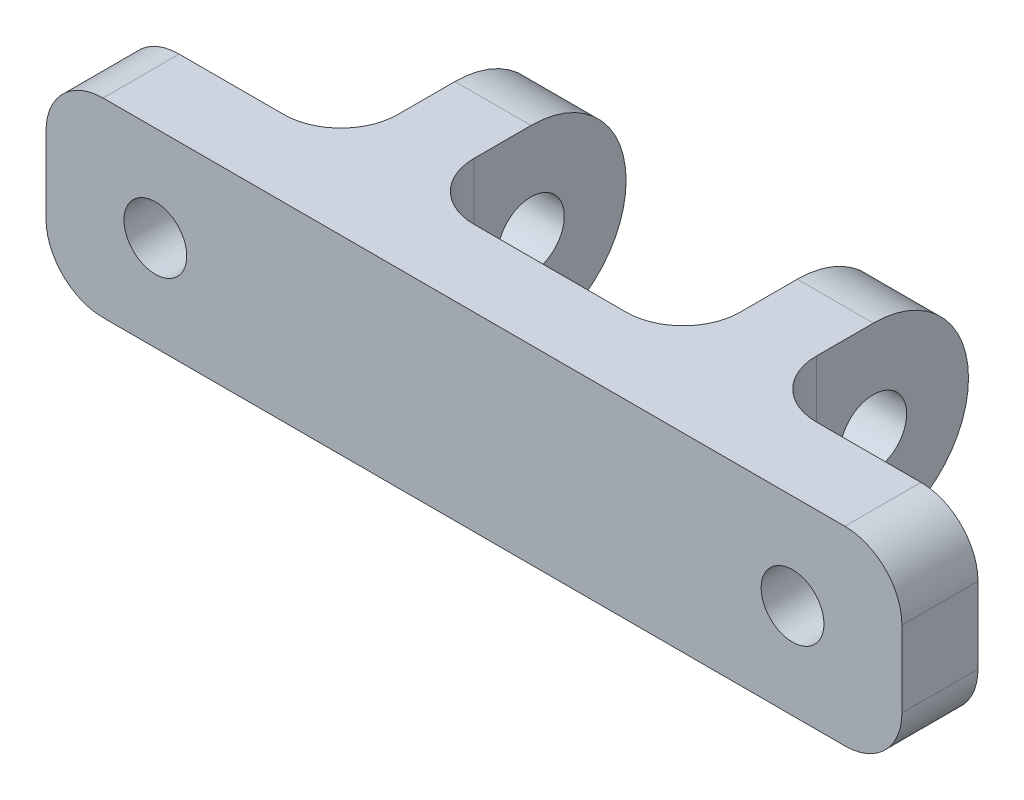
ISO-10303-21;
HEADER;
FILE_DESCRIPTION(('STEP AP214'),'2;1');
FILE_NAME('part.step','',(''),(''),'','','');
FILE_SCHEMA(('AUTOMOTIVE_DESIGN { 1 0 10303 214 1 1 1 1 }'));
ENDSEC;
DATA;
#1=APPLICATION_CONTEXT('core data for automotive mechanical design processes');
#2=APPLICATION_PROTOCOL_DEFINITION('international standard','automotive_design',2000,#1);
#3=PRODUCT_CONTEXT('',#1,'mechanical');
#4=PRODUCT('Part','Part','',(#3));
#5=PRODUCT_RELATED_PRODUCT_CATEGORY('part','',(#4));
#6=PRODUCT_DEFINITION_FORMATION('','',#4);
#7=PRODUCT_DEFINITION_CONTEXT('part definition',#1,'design');
#8=PRODUCT_DEFINITION('design','',#6,#7);
#9=PRODUCT_DEFINITION_SHAPE('','',#8);
#10=(LENGTH_UNIT() NAMED_UNIT(*) SI_UNIT(.MILLI.,.METRE.));
#11=(NAMED_UNIT(*) PLANE_ANGLE_UNIT() SI_UNIT($,.RADIAN.));
#12=(NAMED_UNIT(*) SI_UNIT($,.STERADIAN.) SOLID_ANGLE_UNIT());
#13=UNCERTAINTY_MEASURE_WITH_UNIT(LENGTH_MEASURE(1.E-05),#10,'distance_accuracy_value','');
#14=(GEOMETRIC_REPRESENTATION_CONTEXT(3) GLOBAL_UNCERTAINTY_ASSIGNED_CONTEXT((#13)) GLOBAL_UNIT_ASSIGNED_CONTEXT((#10,
#11,#12)) REPRESENTATION_CONTEXT('',''));
#15=CARTESIAN_POINT('',(0.,0.,0.));
#16=DIRECTION('',(0.,0.,1.));
#17=DIRECTION('',(1.,0.,0.));
#18=AXIS2_PLACEMENT_3D('',#15,#16,#17);
#19=CARTESIAN_POINT('',(11.,10.,0.));
#20=DIRECTION('',(-1.,0.,0.));
#21=DIRECTION('',(0.,0.,1.));
#22=AXIS2_PLACEMENT_3D('',#19,#20,#21);
#23=PLANE('',#22);
#24=CARTESIAN_POINT('',(11.,5.,-2.5));
#25=DIRECTION('',(-1.,0.,0.));
#26=DIRECTION('',(0.,0.,1.));
#27=AXIS2_PLACEMENT_3D('',#24,#25,#26);
#28=CIRCLE('',#27,1.75);
#29=CARTESIAN_POINT('',(11.,5.,-0.749999999999997));
#30=VERTEX_POINT('',#29);
#31=EDGE_CURVE('E442',#30,#30,#28,.T.);
#32=ORIENTED_EDGE('',*,*,#31,.T.);
#33=EDGE_LOOP('',(#32));
#34=FACE_BOUND('',#33,.T.);
#35=DIRECTION('',(0.,0.,-1.));
#36=VECTOR('',#35,1.);
#37=CARTESIAN_POINT('',(11.,10.,0.));
#38=LINE('',#37,#36);
#39=CARTESIAN_POINT('',(11.,10.,0.499999999999999));
#40=VERTEX_POINT('',#39);
#41=CARTESIAN_POINT('',(11.,10.,-2.5));
#42=VERTEX_POINT('',#41);
#43=EDGE_CURVE('E431',#40,#42,#38,.T.);
#44=ORIENTED_EDGE('',*,*,#43,.F.);
#45=DIRECTION('',(0.,-1.,0.));
#46=VECTOR('',#45,1.);
#47=CARTESIAN_POINT('',(11.,10.,0.499999999999999));
#48=LINE('',#47,#46);
#49=CARTESIAN_POINT('',(11.,0.,0.499999999999999));
#50=VERTEX_POINT('',#49);
#51=EDGE_CURVE('E269',#40,#50,#48,.T.);
#52=ORIENTED_EDGE('',*,*,#51,.T.);
#53=DIRECTION('',(0.,0.,-1.));
#54=VECTOR('',#53,1.);
#55=CARTESIAN_POINT('',(11.,0.,0.));
#56=LINE('',#55,#54);
#57=CARTESIAN_POINT('',(11.,0.,-2.5));
#58=VERTEX_POINT('',#57);
#59=EDGE_CURVE('E264',#50,#58,#56,.T.);
#60=ORIENTED_EDGE('',*,*,#59,.T.);
#61=CARTESIAN_POINT('',(11.,5.,-2.5));
#62=DIRECTION('',(-1.,0.,0.));
#63=DIRECTION('',(0.,0.,1.));
#64=AXIS2_PLACEMENT_3D('',#61,#62,#63);
#65=CIRCLE('',#64,5.);
#66=EDGE_CURVE('E267',#42,#58,#65,.T.);
#67=ORIENTED_EDGE('',*,*,#66,.F.);
#68=EDGE_LOOP('',(#44,#52,#60,#67));
#69=FACE_BOUND('',#68,.T.);
#70=ADVANCED_FACE('F125',(#34,#69),#23,.F.);
#71=CARTESIAN_POINT('',(7.,10.,0.));
#72=DIRECTION('',(-1.,0.,0.));
#73=DIRECTION('',(0.,0.,1.));
#74=AXIS2_PLACEMENT_3D('',#71,#72,#73);
#75=PLANE('',#74);
#76=CARTESIAN_POINT('',(7.,5.,-2.5));
#77=DIRECTION('',(-1.,0.,0.));
#78=DIRECTION('',(0.,0.,1.));
#79=AXIS2_PLACEMENT_3D('',#76,#77,#78);
#80=CIRCLE('',#79,1.75);
#81=CARTESIAN_POINT('',(7.,5.,-0.749999999999997));
#82=VERTEX_POINT('',#81);
#83=EDGE_CURVE('E445',#82,#82,#80,.T.);
#84=ORIENTED_EDGE('',*,*,#83,.F.);
#85=EDGE_LOOP('',(#84));
#86=FACE_BOUND('',#85,.T.);
#87=DIRECTION('',(0.,0.,-1.));
#88=VECTOR('',#87,1.);
#89=CARTESIAN_POINT('',(7.,0.,0.));
#90=LINE('',#89,#88);
#91=CARTESIAN_POINT('',(7.,0.,0.499999999999999));
#92=VERTEX_POINT('',#91);
#93=CARTESIAN_POINT('',(7.,0.,-2.5));
#94=VERTEX_POINT('',#93);
#95=EDGE_CURVE('E272',#92,#94,#90,.T.);
#96=ORIENTED_EDGE('',*,*,#95,.F.);
#97=DIRECTION('',(0.,-1.,0.));
#98=VECTOR('',#97,1.);
#99=CARTESIAN_POINT('',(7.,10.,0.499999999999999));
#100=LINE('',#99,#98);
#101=CARTESIAN_POINT('',(7.,10.,0.499999999999999));
#102=VERTEX_POINT('',#101);
#103=EDGE_CURVE('E347',#92,#102,#100,.F.);
#104=ORIENTED_EDGE('',*,*,#103,.T.);
#105=DIRECTION('',(0.,0.,-1.));
#106=VECTOR('',#105,1.);
#107=CARTESIAN_POINT('',(7.,10.,0.));
#108=LINE('',#107,#106);
#109=CARTESIAN_POINT('',(7.,10.,-2.5));
#110=VERTEX_POINT('',#109);
#111=EDGE_CURVE('E396',#102,#110,#108,.T.);
#112=ORIENTED_EDGE('',*,*,#111,.T.);
#113=CARTESIAN_POINT('',(7.,5.,-2.5));
#114=DIRECTION('',(-1.,0.,0.));
#115=DIRECTION('',(0.,0.,1.));
#116=AXIS2_PLACEMENT_3D('',#113,#114,#115);
#117=CIRCLE('',#116,5.);
#118=EDGE_CURVE('E283',#110,#94,#117,.T.);
#119=ORIENTED_EDGE('',*,*,#118,.T.);
#120=EDGE_LOOP('',(#96,#104,#112,#119));
#121=FACE_BOUND('',#120,.T.);
#122=ADVANCED_FACE('F516',(#86,#121),#75,.T.);
#123=CARTESIAN_POINT('',(-7.,10.,0.));
#124=DIRECTION('',(-1.,0.,0.));
#125=DIRECTION('',(0.,0.,1.));
#126=AXIS2_PLACEMENT_3D('',#123,#124,#125);
#127=PLANE('',#126);
#128=CARTESIAN_POINT('',(-7.,5.,-2.5));
#129=DIRECTION('',(-1.,0.,0.));
#130=DIRECTION('',(0.,0.,1.));
#131=AXIS2_PLACEMENT_3D('',#128,#129,#130);
#132=CIRCLE('',#131,1.75);
#133=CARTESIAN_POINT('',(-7.,5.,-0.749999999999997));
#134=VERTEX_POINT('',#133);
#135=EDGE_CURVE('E301',#134,#134,#132,.T.);
#136=ORIENTED_EDGE('',*,*,#135,.T.);
#137=EDGE_LOOP('',(#136));
#138=FACE_BOUND('',#137,.T.);
#139=DIRECTION('',(0.,0.,-1.));
#140=VECTOR('',#139,1.);
#141=CARTESIAN_POINT('',(-7.,10.,0.));
#142=LINE('',#141,#140);
#143=CARTESIAN_POINT('',(-7.,10.,0.5));
#144=VERTEX_POINT('',#143);
#145=CARTESIAN_POINT('',(-7.,10.,-2.5));
#146=VERTEX_POINT('',#145);
#147=EDGE_CURVE('E384',#144,#146,#142,.T.);
#148=ORIENTED_EDGE('',*,*,#147,.F.);
#149=DIRECTION('',(0.,-1.,0.));
#150=VECTOR('',#149,1.);
#151=CARTESIAN_POINT('',(-7.,0.,0.5));
#152=LINE('',#151,#150);
#153=CARTESIAN_POINT('',(-7.,0.,0.5));
#154=VERTEX_POINT('',#153);
#155=EDGE_CURVE('E349',#144,#154,#152,.T.);
#156=ORIENTED_EDGE('',*,*,#155,.T.);
#157=DIRECTION('',(0.,0.,-1.));
#158=VECTOR('',#157,1.);
#159=CARTESIAN_POINT('',(-7.,0.,0.));
#160=LINE('',#159,#158);
#161=CARTESIAN_POINT('',(-7.,0.,-2.5));
#162=VERTEX_POINT('',#161);
#163=EDGE_CURVE('E368',#154,#162,#160,.T.);
#164=ORIENTED_EDGE('',*,*,#163,.T.);
#165=CARTESIAN_POINT('',(-7.,5.,-2.5));
#166=DIRECTION('',(-1.,0.,0.));
#167=DIRECTION('',(0.,0.,1.));
#168=AXIS2_PLACEMENT_3D('',#165,#166,#167);
#169=CIRCLE('',#168,5.);
#170=EDGE_CURVE('E391',#146,#162,#169,.T.);
#171=ORIENTED_EDGE('',*,*,#170,.F.);
#172=EDGE_LOOP('',(#148,#156,#164,#171));
#173=FACE_BOUND('',#172,.T.);
#174=ADVANCED_FACE('F389',(#138,#173),#127,.F.);
#175=CARTESIAN_POINT('',(-11.,10.,0.));
#176=DIRECTION('',(-1.,0.,0.));
#177=DIRECTION('',(0.,0.,1.));
#178=AXIS2_PLACEMENT_3D('',#175,#176,#177);
#179=PLANE('',#178);
#180=CARTESIAN_POINT('',(-11.,5.,-2.5));
#181=DIRECTION('',(-1.,0.,0.));
#182=DIRECTION('',(0.,0.,1.));
#183=AXIS2_PLACEMENT_3D('',#180,#181,#182);
#184=CIRCLE('',#183,1.75);
#185=CARTESIAN_POINT('',(-11.,5.,-0.749999999999997));
#186=VERTEX_POINT('',#185);
#187=EDGE_CURVE('E299',#186,#186,#184,.T.);
#188=ORIENTED_EDGE('',*,*,#187,.F.);
#189=EDGE_LOOP('',(#188));
#190=FACE_BOUND('',#189,.T.);
#191=DIRECTION('',(0.,0.,-1.));
#192=VECTOR('',#191,1.);
#193=CARTESIAN_POINT('',(-11.,0.,0.));
#194=LINE('',#193,#192);
#195=CARTESIAN_POINT('',(-11.,0.,0.500000000000001));
#196=VERTEX_POINT('',#195);
#197=CARTESIAN_POINT('',(-11.,0.,-2.5));
#198=VERTEX_POINT('',#197);
#199=EDGE_CURVE('E409',#196,#198,#194,.T.);
#200=ORIENTED_EDGE('',*,*,#199,.F.);
#201=DIRECTION('',(0.,-1.,0.));
#202=VECTOR('',#201,1.);
#203=CARTESIAN_POINT('',(-11.,10.,0.500000000000001));
#204=LINE('',#203,#202);
#205=CARTESIAN_POINT('',(-11.,10.,0.500000000000001));
#206=VERTEX_POINT('',#205);
#207=EDGE_CURVE('E340',#196,#206,#204,.F.);
#208=ORIENTED_EDGE('',*,*,#207,.T.);
#209=DIRECTION('',(0.,0.,-1.));
#210=VECTOR('',#209,1.);
#211=CARTESIAN_POINT('',(-11.,10.,0.));
#212=LINE('',#211,#210);
#213=CARTESIAN_POINT('',(-11.,10.,-2.5));
#214=VERTEX_POINT('',#213);
#215=EDGE_CURVE('E392',#206,#214,#212,.T.);
#216=ORIENTED_EDGE('',*,*,#215,.T.);
#217=CARTESIAN_POINT('',(-11.,5.,-2.5));
#218=DIRECTION('',(-1.,0.,0.));
#219=DIRECTION('',(0.,0.,1.));
#220=AXIS2_PLACEMENT_3D('',#217,#218,#219);
#221=CIRCLE('',#220,5.);
#222=EDGE_CURVE('E439',#214,#198,#221,.T.);
#223=ORIENTED_EDGE('',*,*,#222,.T.);
#224=EDGE_LOOP('',(#200,#208,#216,#223));
#225=FACE_BOUND('',#224,.T.);
#226=ADVANCED_FACE('F499',(#190,#225),#179,.T.);
#227=CARTESIAN_POINT('',(0.,0.,0.));
#228=DIRECTION('',(0.,1.,0.));
#229=DIRECTION('',(0.,0.,1.));
#230=AXIS2_PLACEMENT_3D('',#227,#228,#229);
#231=PLANE('',#230);
#232=DIRECTION('',(-1.,0.,0.));
#233=VECTOR('',#232,1.);
#234=CARTESIAN_POINT('',(0.,0.,7.5));
#235=LINE('',#234,#233);
#236=CARTESIAN_POINT('',(19.5,0.,7.5));
#237=VERTEX_POINT('',#236);
#238=CARTESIAN_POINT('',(-19.5,0.,7.5));
#239=VERTEX_POINT('',#238);
#240=EDGE_CURVE('E414',#237,#239,#235,.T.);
#241=ORIENTED_EDGE('',*,*,#240,.T.);
#242=DIRECTION('',(0.,0.,-1.));
#243=VECTOR('',#242,1.);
#244=CARTESIAN_POINT('',(-19.5,0.,3.5));
#245=LINE('',#244,#243);
#246=CARTESIAN_POINT('',(-19.5,0.,3.5));
#247=VERTEX_POINT('',#246);
#248=EDGE_CURVE('E292',#239,#247,#245,.T.);
#249=ORIENTED_EDGE('',*,*,#248,.T.);
#250=DIRECTION('',(-1.,0.,0.));
#251=VECTOR('',#250,1.);
#252=CARTESIAN_POINT('',(0.,0.,3.5));
#253=LINE('',#252,#251);
#254=CARTESIAN_POINT('',(-14.,0.,3.5));
#255=VERTEX_POINT('',#254);
#256=EDGE_CURVE('E411',#255,#247,#253,.T.);
#257=ORIENTED_EDGE('',*,*,#256,.F.);
#258=CARTESIAN_POINT('',(-14.,0.,0.500000000000001));
#259=DIRECTION('',(0.,1.,0.));
#260=DIRECTION('',(0.,0.,1.));
#261=AXIS2_PLACEMENT_3D('',#258,#259,#260);
#262=CIRCLE('',#261,3.);
#263=EDGE_CURVE('E356',#255,#196,#262,.T.);
#264=ORIENTED_EDGE('',*,*,#263,.T.);
#265=ORIENTED_EDGE('',*,*,#199,.T.);
#266=DIRECTION('',(-1.,0.,0.));
#267=VECTOR('',#266,1.);
#268=CARTESIAN_POINT('',(22.5,0.,-2.5));
#269=LINE('',#268,#267);
#270=EDGE_CURVE('E290',#162,#198,#269,.T.);
#271=ORIENTED_EDGE('',*,*,#270,.F.);
#272=ORIENTED_EDGE('',*,*,#163,.F.);
#273=CARTESIAN_POINT('',(-4.,0.,0.500000000000001));
#274=DIRECTION('',(0.,1.,0.));
#275=DIRECTION('',(0.,0.,1.));
#276=AXIS2_PLACEMENT_3D('',#273,#274,#275);
#277=CIRCLE('',#276,3.);
#278=CARTESIAN_POINT('',(-4.,0.,3.5));
#279=VERTEX_POINT('',#278);
#280=EDGE_CURVE('E133',#154,#279,#277,.T.);
#281=ORIENTED_EDGE('',*,*,#280,.T.);
#282=DIRECTION('',(-1.,0.,0.));
#283=VECTOR('',#282,1.);
#284=CARTESIAN_POINT('',(0.,0.,3.5));
#285=LINE('',#284,#283);
#286=CARTESIAN_POINT('',(4.,0.,3.5));
#287=VERTEX_POINT('',#286);
#288=EDGE_CURVE('E366',#287,#279,#285,.T.);
#289=ORIENTED_EDGE('',*,*,#288,.F.);
#290=CARTESIAN_POINT('',(4.,0.,0.499999999999999));
#291=DIRECTION('',(0.,1.,0.));
#292=DIRECTION('',(0.,0.,1.));
#293=AXIS2_PLACEMENT_3D('',#290,#291,#292);
#294=CIRCLE('',#293,3.);
#295=EDGE_CURVE('E360',#287,#92,#294,.T.);
#296=ORIENTED_EDGE('',*,*,#295,.T.);
#297=ORIENTED_EDGE('',*,*,#95,.T.);
#298=EDGE_CURVE('E280',#58,#94,#269,.T.);
#299=ORIENTED_EDGE('',*,*,#298,.F.);
#300=ORIENTED_EDGE('',*,*,#59,.F.);
#301=CARTESIAN_POINT('',(14.,0.,0.499999999999998));
#302=DIRECTION('',(0.,1.,0.));
#303=DIRECTION('',(0.,0.,1.));
#304=AXIS2_PLACEMENT_3D('',#301,#302,#303);
#305=CIRCLE('',#304,3.);
#306=CARTESIAN_POINT('',(14.,0.,3.5));
#307=VERTEX_POINT('',#306);
#308=EDGE_CURVE('E352',#50,#307,#305,.T.);
#309=ORIENTED_EDGE('',*,*,#308,.T.);
#310=DIRECTION('',(1.,0.,0.));
#311=VECTOR('',#310,1.);
#312=CARTESIAN_POINT('',(0.,0.,3.5));
#313=LINE('',#312,#311);
#314=CARTESIAN_POINT('',(19.5,0.,3.5));
#315=VERTEX_POINT('',#314);
#316=EDGE_CURVE('E273',#307,#315,#313,.T.);
#317=ORIENTED_EDGE('',*,*,#316,.T.);
#318=DIRECTION('',(0.,0.,-1.));
#319=VECTOR('',#318,1.);
#320=CARTESIAN_POINT('',(19.5,0.,0.));
#321=LINE('',#320,#319);
#322=EDGE_CURVE('E289',#315,#237,#321,.F.);
#323=ORIENTED_EDGE('',*,*,#322,.T.);
#324=EDGE_LOOP('',(#241,#249,#257,#264,#265,#271,#272,#281,#289,#296,#297,#299,#300,#309,#317,#323));
#325=FACE_BOUND('',#324,.T.);
#326=ADVANCED_FACE('F286',(#325),#231,.F.);
#327=CARTESIAN_POINT('',(0.,10.,0.));
#328=DIRECTION('',(0.,1.,0.));
#329=DIRECTION('',(0.,0.,1.));
#330=AXIS2_PLACEMENT_3D('',#327,#328,#329);
#331=PLANE('',#330);
#332=DIRECTION('',(-1.,0.,0.));
#333=VECTOR('',#332,1.);
#334=CARTESIAN_POINT('',(0.,10.,3.5));
#335=LINE('',#334,#333);
#336=CARTESIAN_POINT('',(-14.,10.,3.5));
#337=VERTEX_POINT('',#336);
#338=CARTESIAN_POINT('',(-19.5,10.,3.5));
#339=VERTEX_POINT('',#338);
#340=EDGE_CURVE('E394',#337,#339,#335,.T.);
#341=ORIENTED_EDGE('',*,*,#340,.T.);
#342=DIRECTION('',(0.,0.,-1.));
#343=VECTOR('',#342,1.);
#344=CARTESIAN_POINT('',(-19.5,10.,0.));
#345=LINE('',#344,#343);
#346=CARTESIAN_POINT('',(-19.5,10.,7.5));
#347=VERTEX_POINT('',#346);
#348=EDGE_CURVE('E329',#339,#347,#345,.F.);
#349=ORIENTED_EDGE('',*,*,#348,.T.);
#350=DIRECTION('',(-1.,0.,0.));
#351=VECTOR('',#350,1.);
#352=CARTESIAN_POINT('',(0.,10.,7.5));
#353=LINE('',#352,#351);
#354=CARTESIAN_POINT('',(19.5,10.,7.5));
#355=VERTEX_POINT('',#354);
#356=EDGE_CURVE('E401',#355,#347,#353,.T.);
#357=ORIENTED_EDGE('',*,*,#356,.F.);
#358=DIRECTION('',(0.,0.,-1.));
#359=VECTOR('',#358,1.);
#360=CARTESIAN_POINT('',(19.5,10.,3.5));
#361=LINE('',#360,#359);
#362=CARTESIAN_POINT('',(19.5,10.,3.5));
#363=VERTEX_POINT('',#362);
#364=EDGE_CURVE('E326',#355,#363,#361,.T.);
#365=ORIENTED_EDGE('',*,*,#364,.T.);
#366=DIRECTION('',(1.,0.,0.));
#367=VECTOR('',#366,1.);
#368=CARTESIAN_POINT('',(0.,10.,3.5));
#369=LINE('',#368,#367);
#370=CARTESIAN_POINT('',(14.,10.,3.5));
#371=VERTEX_POINT('',#370);
#372=EDGE_CURVE('E416',#371,#363,#369,.T.);
#373=ORIENTED_EDGE('',*,*,#372,.F.);
#374=CARTESIAN_POINT('',(14.,10.,0.499999999999998));
#375=DIRECTION('',(0.,1.,0.));
#376=DIRECTION('',(0.,0.,1.));
#377=AXIS2_PLACEMENT_3D('',#374,#375,#376);
#378=CIRCLE('',#377,3.);
#379=EDGE_CURVE('E354',#371,#40,#378,.F.);
#380=ORIENTED_EDGE('',*,*,#379,.T.);
#381=ORIENTED_EDGE('',*,*,#43,.T.);
#382=DIRECTION('',(-1.,0.,0.));
#383=VECTOR('',#382,1.);
#384=CARTESIAN_POINT('',(22.5,10.,-2.5));
#385=LINE('',#384,#383);
#386=EDGE_CURVE('E282',#42,#110,#385,.T.);
#387=ORIENTED_EDGE('',*,*,#386,.T.);
#388=ORIENTED_EDGE('',*,*,#111,.F.);
#389=CARTESIAN_POINT('',(4.,10.,0.499999999999999));
#390=DIRECTION('',(0.,1.,0.));
#391=DIRECTION('',(0.,0.,1.));
#392=AXIS2_PLACEMENT_3D('',#389,#390,#391);
#393=CIRCLE('',#392,3.);
#394=CARTESIAN_POINT('',(4.,10.,3.5));
#395=VERTEX_POINT('',#394);
#396=EDGE_CURVE('E362',#102,#395,#393,.F.);
#397=ORIENTED_EDGE('',*,*,#396,.T.);
#398=DIRECTION('',(-1.,0.,0.));
#399=VECTOR('',#398,1.);
#400=CARTESIAN_POINT('',(0.,10.,3.5));
#401=LINE('',#400,#399);
#402=CARTESIAN_POINT('',(-4.,10.,3.5));
#403=VERTEX_POINT('',#402);
#404=EDGE_CURVE('E386',#395,#403,#401,.T.);
#405=ORIENTED_EDGE('',*,*,#404,.T.);
#406=CARTESIAN_POINT('',(-4.,10.,0.500000000000001));
#407=DIRECTION('',(0.,1.,0.));
#408=DIRECTION('',(0.,0.,1.));
#409=AXIS2_PLACEMENT_3D('',#406,#407,#408);
#410=CIRCLE('',#409,3.);
#411=EDGE_CURVE('E12',#403,#144,#410,.F.);
#412=ORIENTED_EDGE('',*,*,#411,.T.);
#413=ORIENTED_EDGE('',*,*,#147,.T.);
#414=EDGE_CURVE('E297',#146,#214,#385,.T.);
#415=ORIENTED_EDGE('',*,*,#414,.T.);
#416=ORIENTED_EDGE('',*,*,#215,.F.);
#417=CARTESIAN_POINT('',(-14.,10.,0.500000000000001));
#418=DIRECTION('',(0.,1.,0.));
#419=DIRECTION('',(0.,0.,1.));
#420=AXIS2_PLACEMENT_3D('',#417,#418,#419);
#421=CIRCLE('',#420,3.);
#422=EDGE_CURVE('E358',#206,#337,#421,.F.);
#423=ORIENTED_EDGE('',*,*,#422,.T.);
#424=EDGE_LOOP('',(#341,#349,#357,#365,#373,#380,#381,#387,#388,#397,#405,#412,#413,#415,#416,#423));
#425=FACE_BOUND('',#424,.T.);
#426=ADVANCED_FACE('F382',(#425),#331,.T.);
#427=CARTESIAN_POINT('',(0.,10.,3.5));
#428=DIRECTION('',(0.,0.,-1.));
#429=DIRECTION('',(-1.,0.,0.));
#430=AXIS2_PLACEMENT_3D('',#427,#428,#429);
#431=PLANE('',#430);
#432=CARTESIAN_POINT('',(16.75,5.,3.5));
#433=DIRECTION('',(0.,0.,-1.));
#434=DIRECTION('',(1.,0.,0.));
#435=AXIS2_PLACEMENT_3D('',#432,#433,#434);
#436=CIRCLE('',#435,1.64999999999999);
#437=CARTESIAN_POINT('',(18.4,5.,3.5));
#438=VERTEX_POINT('',#437);
#439=EDGE_CURVE('E450',#438,#438,#436,.T.);
#440=ORIENTED_EDGE('',*,*,#439,.F.);
#441=EDGE_LOOP('',(#440));
#442=FACE_BOUND('',#441,.T.);
#443=DIRECTION('',(0.,-1.,0.));
#444=VECTOR('',#443,1.);
#445=CARTESIAN_POINT('',(22.5,10.,3.5));
#446=LINE('',#445,#444);
#447=CARTESIAN_POINT('',(22.5,7.,3.5));
#448=VERTEX_POINT('',#447);
#449=CARTESIAN_POINT('',(22.5,3.,3.5));
#450=VERTEX_POINT('',#449);
#451=EDGE_CURVE('E404',#448,#450,#446,.T.);
#452=ORIENTED_EDGE('',*,*,#451,.T.);
#453=CARTESIAN_POINT('',(19.5,3.,3.5));
#454=DIRECTION('',(0.,0.,-1.));
#455=DIRECTION('',(-1.,0.,0.));
#456=AXIS2_PLACEMENT_3D('',#453,#454,#455);
#457=CIRCLE('',#456,3.);
#458=EDGE_CURVE('E140',#450,#315,#457,.T.);
#459=ORIENTED_EDGE('',*,*,#458,.T.);
#460=ORIENTED_EDGE('',*,*,#316,.F.);
#461=DIRECTION('',(0.,-1.,0.));
#462=VECTOR('',#461,1.);
#463=CARTESIAN_POINT('',(14.,10.,3.5));
#464=LINE('',#463,#462);
#465=EDGE_CURVE('E335',#307,#371,#464,.F.);
#466=ORIENTED_EDGE('',*,*,#465,.T.);
#467=ORIENTED_EDGE('',*,*,#372,.T.);
#468=CARTESIAN_POINT('',(19.5,7.,3.5));
#469=DIRECTION('',(0.,0.,-1.));
#470=DIRECTION('',(-1.,0.,0.));
#471=AXIS2_PLACEMENT_3D('',#468,#469,#470);
#472=CIRCLE('',#471,3.);
#473=EDGE_CURVE('E148',#363,#448,#472,.T.);
#474=ORIENTED_EDGE('',*,*,#473,.T.);
#475=EDGE_LOOP('',(#452,#459,#460,#466,#467,#474));
#476=FACE_BOUND('',#475,.T.);
#477=ADVANCED_FACE('F526',(#442,#476),#431,.T.);
#478=CARTESIAN_POINT('',(0.,10.,3.5));
#479=DIRECTION('',(0.,0.,1.));
#480=DIRECTION('',(1.,0.,0.));
#481=AXIS2_PLACEMENT_3D('',#478,#479,#480);
#482=PLANE('',#481);
#483=ORIENTED_EDGE('',*,*,#404,.F.);
#484=DIRECTION('',(0.,-1.,0.));
#485=VECTOR('',#484,1.);
#486=CARTESIAN_POINT('',(4.,10.,3.5));
#487=LINE('',#486,#485);
#488=EDGE_CURVE('E344',#395,#287,#487,.T.);
#489=ORIENTED_EDGE('',*,*,#488,.T.);
#490=ORIENTED_EDGE('',*,*,#288,.T.);
#491=DIRECTION('',(0.,-1.,0.));
#492=VECTOR('',#491,1.);
#493=CARTESIAN_POINT('',(-4.,10.,3.5));
#494=LINE('',#493,#492);
#495=EDGE_CURVE('E342',#279,#403,#494,.F.);
#496=ORIENTED_EDGE('',*,*,#495,.T.);
#497=EDGE_LOOP('',(#483,#489,#490,#496));
#498=FACE_BOUND('',#497,.T.);
#499=ADVANCED_FACE('F374',(#498),#482,.F.);
#500=CARTESIAN_POINT('',(0.,10.,3.5));
#501=DIRECTION('',(0.,0.,1.));
#502=DIRECTION('',(1.,0.,0.));
#503=AXIS2_PLACEMENT_3D('',#500,#501,#502);
#504=PLANE('',#503);
#505=CARTESIAN_POINT('',(-16.75,5.,3.5));
#506=DIRECTION('',(0.,0.,-1.));
#507=DIRECTION('',(-1.,0.,0.));
#508=AXIS2_PLACEMENT_3D('',#505,#506,#507);
#509=CIRCLE('',#508,1.65);
#510=CARTESIAN_POINT('',(-18.4,5.,3.5));
#511=VERTEX_POINT('',#510);
#512=EDGE_CURVE('E456',#511,#511,#509,.T.);
#513=ORIENTED_EDGE('',*,*,#512,.F.);
#514=EDGE_LOOP('',(#513));
#515=FACE_BOUND('',#514,.T.);
#516=ORIENTED_EDGE('',*,*,#256,.T.);
#517=CARTESIAN_POINT('',(-19.5,3.,3.5));
#518=DIRECTION('',(0.,0.,1.));
#519=DIRECTION('',(1.,0.,0.));
#520=AXIS2_PLACEMENT_3D('',#517,#518,#519);
#521=CIRCLE('',#520,3.);
#522=CARTESIAN_POINT('',(-22.5,3.,3.5));
#523=VERTEX_POINT('',#522);
#524=EDGE_CURVE('E311',#247,#523,#521,.F.);
#525=ORIENTED_EDGE('',*,*,#524,.T.);
#526=DIRECTION('',(0.,-1.,0.));
#527=VECTOR('',#526,1.);
#528=CARTESIAN_POINT('',(-22.5,10.,3.5));
#529=LINE('',#528,#527);
#530=CARTESIAN_POINT('',(-22.5,7.,3.5));
#531=VERTEX_POINT('',#530);
#532=EDGE_CURVE('E423',#531,#523,#529,.T.);
#533=ORIENTED_EDGE('',*,*,#532,.F.);
#534=CARTESIAN_POINT('',(-19.5,7.,3.5));
#535=DIRECTION('',(0.,0.,1.));
#536=DIRECTION('',(1.,0.,0.));
#537=AXIS2_PLACEMENT_3D('',#534,#535,#536);
#538=CIRCLE('',#537,3.);
#539=EDGE_CURVE('E309',#531,#339,#538,.F.);
#540=ORIENTED_EDGE('',*,*,#539,.T.);
#541=ORIENTED_EDGE('',*,*,#340,.F.);
#542=DIRECTION('',(0.,-1.,0.));
#543=VECTOR('',#542,1.);
#544=CARTESIAN_POINT('',(-14.,10.,3.5));
#545=LINE('',#544,#543);
#546=EDGE_CURVE('E306',#337,#255,#545,.T.);
#547=ORIENTED_EDGE('',*,*,#546,.T.);
#548=EDGE_LOOP('',(#516,#525,#533,#540,#541,#547));
#549=FACE_BOUND('',#548,.T.);
#550=ADVANCED_FACE('F473',(#515,#549),#504,.F.);
#551=CARTESIAN_POINT('',(-22.5,10.,0.));
#552=DIRECTION('',(-1.,0.,0.));
#553=DIRECTION('',(0.,0.,1.));
#554=AXIS2_PLACEMENT_3D('',#551,#552,#553);
#555=PLANE('',#554);
#556=ORIENTED_EDGE('',*,*,#532,.T.);
#557=DIRECTION('',(0.,0.,-1.));
#558=VECTOR('',#557,1.);
#559=CARTESIAN_POINT('',(-22.5,3.,7.5));
#560=LINE('',#559,#558);
#561=CARTESIAN_POINT('',(-22.5,3.,7.5));
#562=VERTEX_POINT('',#561);
#563=EDGE_CURVE('E316',#523,#562,#560,.F.);
#564=ORIENTED_EDGE('',*,*,#563,.T.);
#565=DIRECTION('',(0.,-1.,0.));
#566=VECTOR('',#565,1.);
#567=CARTESIAN_POINT('',(-22.5,10.,7.5));
#568=LINE('',#567,#566);
#569=CARTESIAN_POINT('',(-22.5,7.,7.5));
#570=VERTEX_POINT('',#569);
#571=EDGE_CURVE('E421',#570,#562,#568,.T.);
#572=ORIENTED_EDGE('',*,*,#571,.F.);
#573=DIRECTION('',(0.,0.,-1.));
#574=VECTOR('',#573,1.);
#575=CARTESIAN_POINT('',(-22.5,7.,0.));
#576=LINE('',#575,#574);
#577=EDGE_CURVE('E313',#570,#531,#576,.T.);
#578=ORIENTED_EDGE('',*,*,#577,.T.);
#579=EDGE_LOOP('',(#556,#564,#572,#578));
#580=FACE_BOUND('',#579,.T.);
#581=ADVANCED_FACE('F476',(#580),#555,.T.);
#582=CARTESIAN_POINT('',(0.,10.,7.5));
#583=DIRECTION('',(0.,0.,1.));
#584=DIRECTION('',(1.,0.,0.));
#585=AXIS2_PLACEMENT_3D('',#582,#583,#584);
#586=PLANE('',#585);
#587=CARTESIAN_POINT('',(-16.75,5.,7.50000000000001));
#588=DIRECTION('',(0.,0.,-1.));
#589=DIRECTION('',(-1.,0.,0.));
#590=AXIS2_PLACEMENT_3D('',#587,#588,#589);
#591=CIRCLE('',#590,1.65);
#592=CARTESIAN_POINT('',(-18.4,5.,7.50000000000001));
#593=VERTEX_POINT('',#592);
#594=EDGE_CURVE('E302',#593,#593,#591,.T.);
#595=ORIENTED_EDGE('',*,*,#594,.T.);
#596=EDGE_LOOP('',(#595));
#597=FACE_BOUND('',#596,.T.);
#598=CARTESIAN_POINT('',(16.75,5.,7.5));
#599=DIRECTION('',(0.,0.,-1.));
#600=DIRECTION('',(1.,0.,0.));
#601=AXIS2_PLACEMENT_3D('',#598,#599,#600);
#602=CIRCLE('',#601,1.64999999999999);
#603=CARTESIAN_POINT('',(18.4,5.,7.5));
#604=VERTEX_POINT('',#603);
#605=EDGE_CURVE('E453',#604,#604,#602,.T.);
#606=ORIENTED_EDGE('',*,*,#605,.T.);
#607=EDGE_LOOP('',(#606));
#608=FACE_BOUND('',#607,.T.);
#609=ORIENTED_EDGE('',*,*,#571,.T.);
#610=CARTESIAN_POINT('',(-19.5,3.,7.5));
#611=DIRECTION('',(0.,0.,1.));
#612=DIRECTION('',(1.,0.,0.));
#613=AXIS2_PLACEMENT_3D('',#610,#611,#612);
#614=CIRCLE('',#613,3.);
#615=EDGE_CURVE('E324',#562,#239,#614,.T.);
#616=ORIENTED_EDGE('',*,*,#615,.T.);
#617=ORIENTED_EDGE('',*,*,#240,.F.);
#618=CARTESIAN_POINT('',(19.5,3.,7.5));
#619=DIRECTION('',(0.,0.,1.));
#620=DIRECTION('',(1.,0.,0.));
#621=AXIS2_PLACEMENT_3D('',#618,#619,#620);
#622=CIRCLE('',#621,3.);
#623=CARTESIAN_POINT('',(22.5,3.,7.5));
#624=VERTEX_POINT('',#623);
#625=EDGE_CURVE('E320',#237,#624,#622,.T.);
#626=ORIENTED_EDGE('',*,*,#625,.T.);
#627=DIRECTION('',(0.,-1.,0.));
#628=VECTOR('',#627,1.);
#629=CARTESIAN_POINT('',(22.5,10.,7.5));
#630=LINE('',#629,#628);
#631=CARTESIAN_POINT('',(22.5,7.,7.5));
#632=VERTEX_POINT('',#631);
#633=EDGE_CURVE('E418',#632,#624,#630,.T.);
#634=ORIENTED_EDGE('',*,*,#633,.F.);
#635=CARTESIAN_POINT('',(19.5,7.,7.5));
#636=DIRECTION('',(0.,0.,1.));
#637=DIRECTION('',(1.,0.,0.));
#638=AXIS2_PLACEMENT_3D('',#635,#636,#637);
#639=CIRCLE('',#638,3.);
#640=EDGE_CURVE('E318',#632,#355,#639,.T.);
#641=ORIENTED_EDGE('',*,*,#640,.T.);
#642=ORIENTED_EDGE('',*,*,#356,.T.);
#643=CARTESIAN_POINT('',(-19.5,7.,7.5));
#644=DIRECTION('',(0.,0.,1.));
#645=DIRECTION('',(1.,0.,0.));
#646=AXIS2_PLACEMENT_3D('',#643,#644,#645);
#647=CIRCLE('',#646,3.);
#648=EDGE_CURVE('E322',#347,#570,#647,.T.);
#649=ORIENTED_EDGE('',*,*,#648,.T.);
#650=EDGE_LOOP('',(#609,#616,#617,#626,#634,#641,#642,#649));
#651=FACE_BOUND('',#650,.T.);
#652=ADVANCED_FACE('F462',(#597,#608,#651),#586,.T.);
#653=CARTESIAN_POINT('',(22.5,10.,0.));
#654=DIRECTION('',(-1.,0.,0.));
#655=DIRECTION('',(0.,0.,1.));
#656=AXIS2_PLACEMENT_3D('',#653,#654,#655);
#657=PLANE('',#656);
#658=ORIENTED_EDGE('',*,*,#633,.T.);
#659=DIRECTION('',(0.,0.,-1.));
#660=VECTOR('',#659,1.);
#661=CARTESIAN_POINT('',(22.5,3.,0.));
#662=LINE('',#661,#660);
#663=EDGE_CURVE('E333',#624,#450,#662,.T.);
#664=ORIENTED_EDGE('',*,*,#663,.T.);
#665=ORIENTED_EDGE('',*,*,#451,.F.);
#666=DIRECTION('',(0.,0.,-1.));
#667=VECTOR('',#666,1.);
#668=CARTESIAN_POINT('',(22.5,7.,7.5));
#669=LINE('',#668,#667);
#670=EDGE_CURVE('E331',#448,#632,#669,.F.);
#671=ORIENTED_EDGE('',*,*,#670,.T.);
#672=EDGE_LOOP('',(#658,#664,#665,#671));
#673=FACE_BOUND('',#672,.T.);
#674=ADVANCED_FACE('F504',(#673),#657,.F.);
#675=CARTESIAN_POINT('',(22.5,5.,-2.5));
#676=DIRECTION('',(-1.,0.,0.));
#677=DIRECTION('',(0.,0.,1.));
#678=AXIS2_PLACEMENT_3D('',#675,#676,#677);
#679=CYLINDRICAL_SURFACE('',#678,5.);
#680=ORIENTED_EDGE('',*,*,#170,.T.);
#681=ORIENTED_EDGE('',*,*,#270,.T.);
#682=ORIENTED_EDGE('',*,*,#222,.F.);
#683=ORIENTED_EDGE('',*,*,#414,.F.);
#684=EDGE_LOOP('',(#680,#681,#682,#683));
#685=FACE_BOUND('',#684,.T.);
#686=ADVANCED_FACE('F502',(#685),#679,.T.);
#687=ORIENTED_EDGE('',*,*,#66,.T.);
#688=ORIENTED_EDGE('',*,*,#298,.T.);
#689=ORIENTED_EDGE('',*,*,#118,.F.);
#690=ORIENTED_EDGE('',*,*,#386,.F.);
#691=EDGE_LOOP('',(#687,#688,#689,#690));
#692=FACE_BOUND('',#691,.T.);
#693=ADVANCED_FACE('F278',(#692),#679,.T.);
#694=CARTESIAN_POINT('',(22.5,5.,-2.5));
#695=DIRECTION('',(-1.,0.,0.));
#696=DIRECTION('',(0.,0.,1.));
#697=AXIS2_PLACEMENT_3D('',#694,#695,#696);
#698=CYLINDRICAL_SURFACE('',#697,1.75);
#699=ORIENTED_EDGE('',*,*,#187,.T.);
#700=EDGE_LOOP('',(#699));
#701=FACE_BOUND('',#700,.T.);
#702=ORIENTED_EDGE('',*,*,#135,.F.);
#703=EDGE_LOOP('',(#702));
#704=FACE_BOUND('',#703,.T.);
#705=ADVANCED_FACE('F510',(#701,#704),#698,.F.);
#706=ORIENTED_EDGE('',*,*,#83,.T.);
#707=EDGE_LOOP('',(#706));
#708=FACE_BOUND('',#707,.T.);
#709=ORIENTED_EDGE('',*,*,#31,.F.);
#710=EDGE_LOOP('',(#709));
#711=FACE_BOUND('',#710,.T.);
#712=ADVANCED_FACE('F696',(#708,#711),#698,.F.);
#713=CARTESIAN_POINT('',(16.75,5.,7.5));
#714=DIRECTION('',(0.,0.,-1.));
#715=DIRECTION('',(-1.,0.,0.));
#716=AXIS2_PLACEMENT_3D('',#713,#714,#715);
#717=CYLINDRICAL_SURFACE('',#716,1.64999999999999);
#718=ORIENTED_EDGE('',*,*,#605,.F.);
#719=EDGE_LOOP('',(#718));
#720=FACE_BOUND('',#719,.T.);
#721=ORIENTED_EDGE('',*,*,#439,.T.);
#722=EDGE_LOOP('',(#721));
#723=FACE_BOUND('',#722,.T.);
#724=ADVANCED_FACE('F469',(#720,#723),#717,.F.);
#725=CARTESIAN_POINT('',(-16.75,5.,7.50000000000001));
#726=DIRECTION('',(0.,0.,-1.));
#727=DIRECTION('',(-1.,0.,0.));
#728=AXIS2_PLACEMENT_3D('',#725,#726,#727);
#729=CYLINDRICAL_SURFACE('',#728,1.65);
#730=ORIENTED_EDGE('',*,*,#594,.F.);
#731=EDGE_LOOP('',(#730));
#732=FACE_BOUND('',#731,.T.);
#733=ORIENTED_EDGE('',*,*,#512,.T.);
#734=EDGE_LOOP('',(#733));
#735=FACE_BOUND('',#734,.T.);
#736=ADVANCED_FACE('F465',(#732,#735),#729,.F.);
#737=CARTESIAN_POINT('',(-19.5,3.,0.));
#738=DIRECTION('',(0.,0.,1.));
#739=DIRECTION('',(1.,0.,0.));
#740=AXIS2_PLACEMENT_3D('',#737,#738,#739);
#741=CYLINDRICAL_SURFACE('',#740,3.);
#742=ORIENTED_EDGE('',*,*,#615,.F.);
#743=ORIENTED_EDGE('',*,*,#563,.F.);
#744=ORIENTED_EDGE('',*,*,#524,.F.);
#745=ORIENTED_EDGE('',*,*,#248,.F.);
#746=EDGE_LOOP('',(#742,#743,#744,#745));
#747=FACE_BOUND('',#746,.T.);
#748=ADVANCED_FACE('F468',(#747),#741,.T.);
#749=CARTESIAN_POINT('',(-19.5,7.,0.));
#750=DIRECTION('',(0.,0.,-1.));
#751=DIRECTION('',(-1.,0.,0.));
#752=AXIS2_PLACEMENT_3D('',#749,#750,#751);
#753=CYLINDRICAL_SURFACE('',#752,3.);
#754=ORIENTED_EDGE('',*,*,#648,.F.);
#755=ORIENTED_EDGE('',*,*,#348,.F.);
#756=ORIENTED_EDGE('',*,*,#539,.F.);
#757=ORIENTED_EDGE('',*,*,#577,.F.);
#758=EDGE_LOOP('',(#754,#755,#756,#757));
#759=FACE_BOUND('',#758,.T.);
#760=ADVANCED_FACE('F493',(#759),#753,.T.);
#761=CARTESIAN_POINT('',(19.5,3.,0.));
#762=DIRECTION('',(0.,0.,-1.));
#763=DIRECTION('',(-1.,0.,0.));
#764=AXIS2_PLACEMENT_3D('',#761,#762,#763);
#765=CYLINDRICAL_SURFACE('',#764,3.);
#766=ORIENTED_EDGE('',*,*,#625,.F.);
#767=ORIENTED_EDGE('',*,*,#322,.F.);
#768=ORIENTED_EDGE('',*,*,#458,.F.);
#769=ORIENTED_EDGE('',*,*,#663,.F.);
#770=EDGE_LOOP('',(#766,#767,#768,#769));
#771=FACE_BOUND('',#770,.T.);
#772=ADVANCED_FACE('F534',(#771),#765,.T.);
#773=CARTESIAN_POINT('',(19.5,7.,0.));
#774=DIRECTION('',(0.,0.,1.));
#775=DIRECTION('',(1.,0.,0.));
#776=AXIS2_PLACEMENT_3D('',#773,#774,#775);
#777=CYLINDRICAL_SURFACE('',#776,3.);
#778=ORIENTED_EDGE('',*,*,#640,.F.);
#779=ORIENTED_EDGE('',*,*,#670,.F.);
#780=ORIENTED_EDGE('',*,*,#473,.F.);
#781=ORIENTED_EDGE('',*,*,#364,.F.);
#782=EDGE_LOOP('',(#778,#779,#780,#781));
#783=FACE_BOUND('',#782,.T.);
#784=ADVANCED_FACE('F537',(#783),#777,.T.);
#785=CARTESIAN_POINT('',(14.,10.,0.499999999999998));
#786=DIRECTION('',(0.,-1.,0.));
#787=DIRECTION('',(0.,0.,-1.));
#788=AXIS2_PLACEMENT_3D('',#785,#786,#787);
#789=CYLINDRICAL_SURFACE('',#788,3.);
#790=ORIENTED_EDGE('',*,*,#379,.F.);
#791=ORIENTED_EDGE('',*,*,#465,.F.);
#792=ORIENTED_EDGE('',*,*,#308,.F.);
#793=ORIENTED_EDGE('',*,*,#51,.F.);
#794=EDGE_LOOP('',(#790,#791,#792,#793));
#795=FACE_BOUND('',#794,.T.);
#796=ADVANCED_FACE('F540',(#795),#789,.F.);
#797=CARTESIAN_POINT('',(-14.,10.,0.500000000000001));
#798=DIRECTION('',(0.,-1.,0.));
#799=DIRECTION('',(0.,0.,-1.));
#800=AXIS2_PLACEMENT_3D('',#797,#798,#799);
#801=CYLINDRICAL_SURFACE('',#800,3.);
#802=ORIENTED_EDGE('',*,*,#422,.F.);
#803=ORIENTED_EDGE('',*,*,#207,.F.);
#804=ORIENTED_EDGE('',*,*,#263,.F.);
#805=ORIENTED_EDGE('',*,*,#546,.F.);
#806=EDGE_LOOP('',(#802,#803,#804,#805));
#807=FACE_BOUND('',#806,.T.);
#808=ADVANCED_FACE('F497',(#807),#801,.F.);
#809=CARTESIAN_POINT('',(4.,10.,0.499999999999999));
#810=DIRECTION('',(0.,-1.,0.));
#811=DIRECTION('',(0.,0.,-1.));
#812=AXIS2_PLACEMENT_3D('',#809,#810,#811);
#813=CYLINDRICAL_SURFACE('',#812,3.);
#814=ORIENTED_EDGE('',*,*,#396,.F.);
#815=ORIENTED_EDGE('',*,*,#103,.F.);
#816=ORIENTED_EDGE('',*,*,#295,.F.);
#817=ORIENTED_EDGE('',*,*,#488,.F.);
#818=EDGE_LOOP('',(#814,#815,#816,#817));
#819=FACE_BOUND('',#818,.T.);
#820=ADVANCED_FACE('F546',(#819),#813,.F.);
#821=CARTESIAN_POINT('',(-4.,10.,0.500000000000001));
#822=DIRECTION('',(0.,1.,0.));
#823=DIRECTION('',(0.,0.,1.));
#824=AXIS2_PLACEMENT_3D('',#821,#822,#823);
#825=CYLINDRICAL_SURFACE('',#824,3.);
#826=ORIENTED_EDGE('',*,*,#411,.F.);
#827=ORIENTED_EDGE('',*,*,#495,.F.);
#828=ORIENTED_EDGE('',*,*,#280,.F.);
#829=ORIENTED_EDGE('',*,*,#155,.F.);
#830=EDGE_LOOP('',(#826,#827,#828,#829));
#831=FACE_BOUND('',#830,.T.);
#832=ADVANCED_FACE('F127',(#831),#825,.F.);
#833=CLOSED_SHELL('',(#70,#122,#174,#226,#326,#426,#477,#499,#550,#581,#652,#674,#686,#693,#705,
#712,#724,#736,#748,#760,#772,#784,#796,#808,#820,#832));
#834=MANIFOLD_SOLID_BREP('B2',#833);
#835=ADVANCED_BREP_SHAPE_REPRESENTATION('',(#18,#834),#14);
#836=SHAPE_DEFINITION_REPRESENTATION(#9,#835);
ENDSEC;
END-ISO-10303-21;
